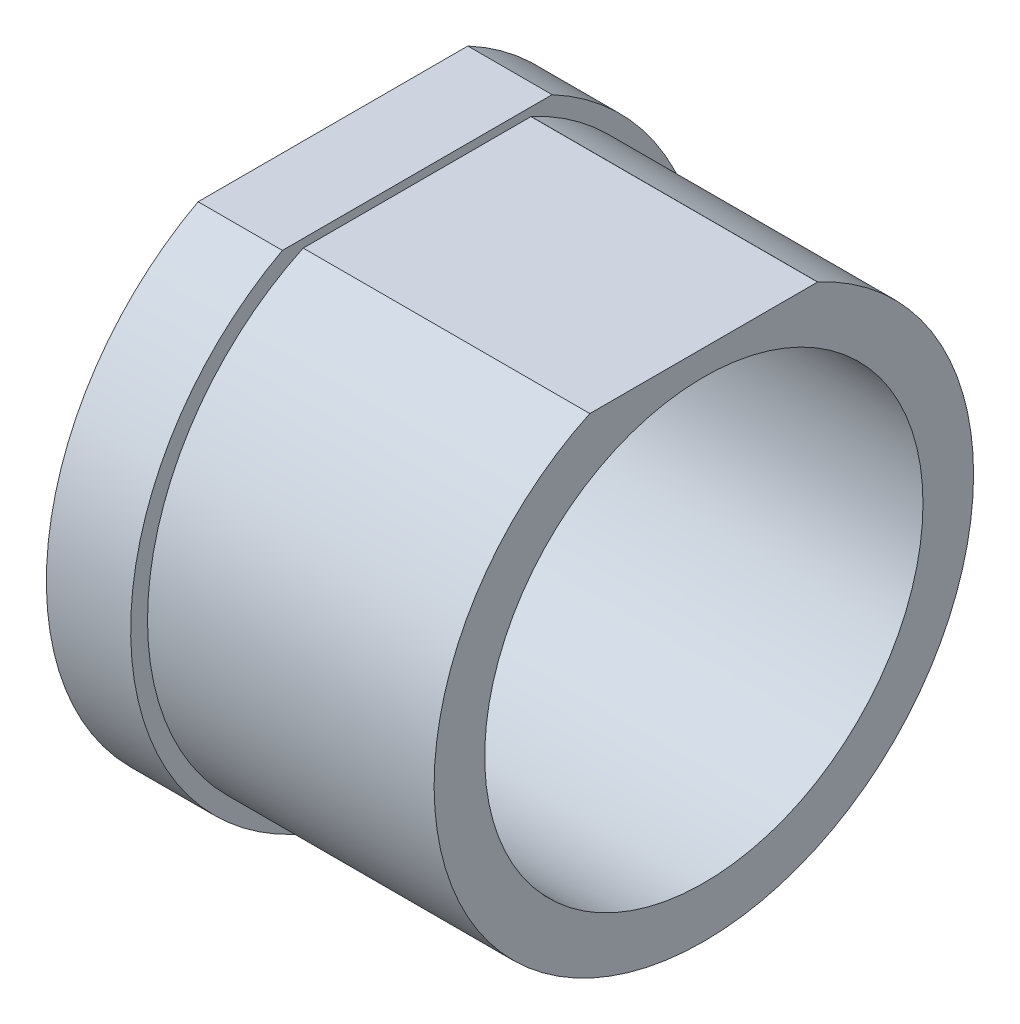
ISO-10303-21;
HEADER;
FILE_DESCRIPTION(('STEP AP214'),'2;1');
FILE_NAME('part.step','',(''),(''),'','','');
FILE_SCHEMA(('AUTOMOTIVE_DESIGN { 1 0 10303 214 1 1 1 1 }'));
ENDSEC;
DATA;
#1=APPLICATION_CONTEXT('core data for automotive mechanical design processes');
#2=APPLICATION_PROTOCOL_DEFINITION('international standard','automotive_design',2000,#1);
#3=PRODUCT_CONTEXT('',#1,'mechanical');
#4=PRODUCT('Part','Part','',(#3));
#5=PRODUCT_RELATED_PRODUCT_CATEGORY('part','',(#4));
#6=PRODUCT_DEFINITION_FORMATION('','',#4);
#7=PRODUCT_DEFINITION_CONTEXT('part definition',#1,'design');
#8=PRODUCT_DEFINITION('design','',#6,#7);
#9=PRODUCT_DEFINITION_SHAPE('','',#8);
#10=(LENGTH_UNIT() NAMED_UNIT(*) SI_UNIT(.MILLI.,.METRE.));
#11=(NAMED_UNIT(*) PLANE_ANGLE_UNIT() SI_UNIT($,.RADIAN.));
#12=(NAMED_UNIT(*) SI_UNIT($,.STERADIAN.) SOLID_ANGLE_UNIT());
#13=UNCERTAINTY_MEASURE_WITH_UNIT(LENGTH_MEASURE(1.E-05),#10,'distance_accuracy_value','');
#14=(GEOMETRIC_REPRESENTATION_CONTEXT(3) GLOBAL_UNCERTAINTY_ASSIGNED_CONTEXT((#13)) GLOBAL_UNIT_ASSIGNED_CONTEXT((#10,
#11,#12)) REPRESENTATION_CONTEXT('',''));
#15=CARTESIAN_POINT('',(0.,0.,0.));
#16=DIRECTION('',(0.,0.,1.));
#17=DIRECTION('',(1.,0.,0.));
#18=AXIS2_PLACEMENT_3D('',#15,#16,#17);
#19=CARTESIAN_POINT('',(10.,0.,0.));
#20=DIRECTION('',(-1.,0.,0.));
#21=DIRECTION('',(0.,0.,1.));
#22=AXIS2_PLACEMENT_3D('',#19,#20,#21);
#23=CYLINDRICAL_SURFACE('',#22,34.);
#24=CARTESIAN_POINT('',(10.,0.,0.));
#25=DIRECTION('',(1.,0.,0.));
#26=DIRECTION('',(0.,0.,-1.));
#27=AXIS2_PLACEMENT_3D('',#24,#25,#26);
#28=CIRCLE('',#27,34.);
#29=CARTESIAN_POINT('',(10.,30.,16.));
#30=VERTEX_POINT('',#29);
#31=CARTESIAN_POINT('',(10.,30.,-16.));
#32=VERTEX_POINT('',#31);
#33=EDGE_CURVE('E101',#30,#32,#28,.T.);
#34=ORIENTED_EDGE('',*,*,#33,.F.);
#35=DIRECTION('',(-1.,0.,0.));
#36=VECTOR('',#35,1.);
#37=CARTESIAN_POINT('',(10.,30.,16.));
#38=LINE('',#37,#36);
#39=CARTESIAN_POINT('',(0.,30.,16.));
#40=VERTEX_POINT('',#39);
#41=EDGE_CURVE('E89',#40,#30,#38,.F.);
#42=ORIENTED_EDGE('',*,*,#41,.F.);
#43=CARTESIAN_POINT('',(0.,0.,0.));
#44=DIRECTION('',(1.,0.,0.));
#45=DIRECTION('',(0.,0.,-1.));
#46=AXIS2_PLACEMENT_3D('',#43,#44,#45);
#47=CIRCLE('',#46,34.);
#48=CARTESIAN_POINT('',(0.,30.,-16.));
#49=VERTEX_POINT('',#48);
#50=EDGE_CURVE('E99',#40,#49,#47,.T.);
#51=ORIENTED_EDGE('',*,*,#50,.T.);
#52=DIRECTION('',(-1.,0.,0.));
#53=VECTOR('',#52,1.);
#54=CARTESIAN_POINT('',(10.,30.,-16.));
#55=LINE('',#54,#53);
#56=EDGE_CURVE('E58',#32,#49,#55,.T.);
#57=ORIENTED_EDGE('',*,*,#56,.F.);
#58=EDGE_LOOP('',(#34,#42,#51,#57));
#59=FACE_BOUND('',#58,.T.);
#60=ADVANCED_FACE('F43',(#59),#23,.T.);
#61=CARTESIAN_POINT('',(10.,0.,0.));
#62=DIRECTION('',(1.,0.,0.));
#63=DIRECTION('',(0.,0.,-1.));
#64=AXIS2_PLACEMENT_3D('',#61,#62,#63);
#65=PLANE('',#64);
#66=DIRECTION('',(0.,0.,1.));
#67=VECTOR('',#66,1.);
#68=CARTESIAN_POINT('',(10.,30.,-23.6606310705221));
#69=LINE('',#68,#67);
#70=EDGE_CURVE('E95',#32,#30,#69,.T.);
#71=ORIENTED_EDGE('',*,*,#70,.T.);
#72=ORIENTED_EDGE('',*,*,#33,.T.);
#73=EDGE_LOOP('',(#71,#72));
#74=FACE_BOUND('',#73,.T.);
#75=DIRECTION('',(0.,1.,0.));
#76=VECTOR('',#75,1.);
#77=CARTESIAN_POINT('',(10.,36.688048190982,-13.4918079689534));
#78=LINE('',#77,#76);
#79=CARTESIAN_POINT('',(10.,29.,-13.4918079689534));
#80=VERTEX_POINT('',#79);
#81=CARTESIAN_POINT('',(10.,29.0167385784289,-13.4918079689534));
#82=VERTEX_POINT('',#81);
#83=EDGE_CURVE('E135',#80,#82,#78,.T.);
#84=ORIENTED_EDGE('',*,*,#83,.T.);
#85=CARTESIAN_POINT('',(10.,0.,0.));
#86=DIRECTION('',(1.,0.,0.));
#87=DIRECTION('',(0.,0.,-1.));
#88=AXIS2_PLACEMENT_3D('',#85,#86,#87);
#89=CIRCLE('',#88,32.);
#90=CARTESIAN_POINT('',(10.,29.,13.5277492584687));
#91=VERTEX_POINT('',#90);
#92=EDGE_CURVE('E51',#91,#82,#89,.T.);
#93=ORIENTED_EDGE('',*,*,#92,.F.);
#94=DIRECTION('',(0.,0.,-1.));
#95=VECTOR('',#94,1.);
#96=CARTESIAN_POINT('',(10.,29.,13.5618643674799));
#97=LINE('',#96,#95);
#98=EDGE_CURVE('E139',#91,#80,#97,.T.);
#99=ORIENTED_EDGE('',*,*,#98,.T.);
#100=EDGE_LOOP('',(#84,#93,#99));
#101=FACE_BOUND('',#100,.T.);
#102=ADVANCED_FACE('F162',(#74,#101),#65,.T.);
#103=CARTESIAN_POINT('',(0.,0.,0.));
#104=DIRECTION('',(1.,0.,0.));
#105=DIRECTION('',(0.,0.,-1.));
#106=AXIS2_PLACEMENT_3D('',#103,#104,#105);
#107=PLANE('',#106);
#108=CARTESIAN_POINT('',(0.,0.,0.));
#109=DIRECTION('',(1.,0.,0.));
#110=DIRECTION('',(0.,0.,-1.));
#111=AXIS2_PLACEMENT_3D('',#108,#109,#110);
#112=CIRCLE('',#111,26.);
#113=CARTESIAN_POINT('',(0.,0.,-26.));
#114=VERTEX_POINT('',#113);
#115=EDGE_CURVE('E112',#114,#114,#112,.T.);
#116=ORIENTED_EDGE('',*,*,#115,.T.);
#117=EDGE_LOOP('',(#116));
#118=FACE_BOUND('',#117,.T.);
#119=ORIENTED_EDGE('',*,*,#50,.F.);
#120=DIRECTION('',(0.,0.,1.));
#121=VECTOR('',#120,1.);
#122=CARTESIAN_POINT('',(0.,30.,-23.6606310705221));
#123=LINE('',#122,#121);
#124=EDGE_CURVE('E86',#49,#40,#123,.T.);
#125=ORIENTED_EDGE('',*,*,#124,.F.);
#126=EDGE_LOOP('',(#119,#125));
#127=FACE_BOUND('',#126,.T.);
#128=ADVANCED_FACE('F104',(#118,#127),#107,.F.);
#129=CARTESIAN_POINT('',(44.,0.,0.));
#130=DIRECTION('',(-1.,0.,0.));
#131=DIRECTION('',(0.,0.,1.));
#132=AXIS2_PLACEMENT_3D('',#129,#130,#131);
#133=CYLINDRICAL_SURFACE('',#132,32.);
#134=ORIENTED_EDGE('',*,*,#92,.T.);
#135=DIRECTION('',(-1.,0.,0.));
#136=VECTOR('',#135,1.);
#137=CARTESIAN_POINT('',(44.,29.0167385784289,-13.4918079689534));
#138=LINE('',#137,#136);
#139=CARTESIAN_POINT('',(44.,29.0167385784289,-13.4918079689534));
#140=VERTEX_POINT('',#139);
#141=EDGE_CURVE('E122',#82,#140,#138,.F.);
#142=ORIENTED_EDGE('',*,*,#141,.T.);
#143=CARTESIAN_POINT('',(44.,0.,0.));
#144=DIRECTION('',(1.,0.,0.));
#145=DIRECTION('',(0.,0.,-1.));
#146=AXIS2_PLACEMENT_3D('',#143,#144,#145);
#147=CIRCLE('',#146,32.);
#148=CARTESIAN_POINT('',(44.,29.,13.5277492584687));
#149=VERTEX_POINT('',#148);
#150=EDGE_CURVE('E106',#149,#140,#147,.T.);
#151=ORIENTED_EDGE('',*,*,#150,.F.);
#152=DIRECTION('',(-1.,0.,0.));
#153=VECTOR('',#152,1.);
#154=CARTESIAN_POINT('',(44.,29.,13.5277492584687));
#155=LINE('',#154,#153);
#156=EDGE_CURVE('E65',#149,#91,#155,.T.);
#157=ORIENTED_EDGE('',*,*,#156,.T.);
#158=EDGE_LOOP('',(#134,#142,#151,#157));
#159=FACE_BOUND('',#158,.T.);
#160=ADVANCED_FACE('F171',(#159),#133,.T.);
#161=CARTESIAN_POINT('',(44.,0.,0.));
#162=DIRECTION('',(1.,0.,0.));
#163=DIRECTION('',(0.,0.,-1.));
#164=AXIS2_PLACEMENT_3D('',#161,#162,#163);
#165=PLANE('',#164);
#166=DIRECTION('',(0.,1.,0.));
#167=VECTOR('',#166,1.);
#168=CARTESIAN_POINT('',(44.,36.688048190982,-13.4918079689534));
#169=LINE('',#168,#167);
#170=CARTESIAN_POINT('',(44.,29.,-13.4918079689534));
#171=VERTEX_POINT('',#170);
#172=EDGE_CURVE('E136',#171,#140,#169,.T.);
#173=ORIENTED_EDGE('',*,*,#172,.F.);
#174=DIRECTION('',(0.,0.,-1.));
#175=VECTOR('',#174,1.);
#176=CARTESIAN_POINT('',(44.,29.,0.));
#177=LINE('',#176,#175);
#178=EDGE_CURVE('E11',#149,#171,#177,.T.);
#179=ORIENTED_EDGE('',*,*,#178,.F.);
#180=ORIENTED_EDGE('',*,*,#150,.T.);
#181=EDGE_LOOP('',(#173,#179,#180));
#182=FACE_BOUND('',#181,.T.);
#183=CARTESIAN_POINT('',(44.,0.,0.));
#184=DIRECTION('',(1.,0.,0.));
#185=DIRECTION('',(0.,0.,-1.));
#186=AXIS2_PLACEMENT_3D('',#183,#184,#185);
#187=CIRCLE('',#186,26.);
#188=CARTESIAN_POINT('',(44.,0.,-26.));
#189=VERTEX_POINT('',#188);
#190=EDGE_CURVE('E118',#189,#189,#187,.T.);
#191=ORIENTED_EDGE('',*,*,#190,.F.);
#192=EDGE_LOOP('',(#191));
#193=FACE_BOUND('',#192,.T.);
#194=ADVANCED_FACE('F175',(#182,#193),#165,.T.);
#195=CARTESIAN_POINT('',(0.,0.,0.));
#196=DIRECTION('',(1.,0.,0.));
#197=DIRECTION('',(0.,0.,-1.));
#198=AXIS2_PLACEMENT_3D('',#195,#196,#197);
#199=CYLINDRICAL_SURFACE('',#198,26.);
#200=ORIENTED_EDGE('',*,*,#115,.F.);
#201=EDGE_LOOP('',(#200));
#202=FACE_BOUND('',#201,.T.);
#203=ORIENTED_EDGE('',*,*,#190,.T.);
#204=EDGE_LOOP('',(#203));
#205=FACE_BOUND('',#204,.T.);
#206=ADVANCED_FACE('F180',(#202,#205),#199,.F.);
#207=CARTESIAN_POINT('',(10.,36.688048190982,-13.4918079689534));
#208=DIRECTION('',(0.,0.,-1.));
#209=DIRECTION('',(0.,1.,0.));
#210=AXIS2_PLACEMENT_3D('',#207,#208,#209);
#211=PLANE('',#210);
#212=ORIENTED_EDGE('',*,*,#83,.F.);
#213=DIRECTION('',(1.,0.,0.));
#214=VECTOR('',#213,1.);
#215=CARTESIAN_POINT('',(10.,29.,-13.4918079689534));
#216=LINE('',#215,#214);
#217=EDGE_CURVE('E131',#80,#171,#216,.T.);
#218=ORIENTED_EDGE('',*,*,#217,.T.);
#219=ORIENTED_EDGE('',*,*,#172,.T.);
#220=ORIENTED_EDGE('',*,*,#141,.F.);
#221=EDGE_LOOP('',(#212,#218,#219,#220));
#222=FACE_BOUND('',#221,.T.);
#223=ADVANCED_FACE('F178',(#222),#211,.F.);
#224=CARTESIAN_POINT('',(10.,29.,13.5618643674799));
#225=DIRECTION('',(0.,-1.,0.));
#226=DIRECTION('',(0.,0.,-1.));
#227=AXIS2_PLACEMENT_3D('',#224,#225,#226);
#228=PLANE('',#227);
#229=ORIENTED_EDGE('',*,*,#178,.T.);
#230=ORIENTED_EDGE('',*,*,#217,.F.);
#231=ORIENTED_EDGE('',*,*,#98,.F.);
#232=ORIENTED_EDGE('',*,*,#156,.F.);
#233=EDGE_LOOP('',(#229,#230,#231,#232));
#234=FACE_BOUND('',#233,.T.);
#235=ADVANCED_FACE('F177',(#234),#228,.F.);
#236=CARTESIAN_POINT('',(44.001,30.,-23.6606310705221));
#237=DIRECTION('',(0.,-1.,0.));
#238=DIRECTION('',(0.,0.,-1.));
#239=AXIS2_PLACEMENT_3D('',#236,#237,#238);
#240=PLANE('',#239);
#241=ORIENTED_EDGE('',*,*,#41,.T.);
#242=ORIENTED_EDGE('',*,*,#70,.F.);
#243=ORIENTED_EDGE('',*,*,#56,.T.);
#244=ORIENTED_EDGE('',*,*,#124,.T.);
#245=EDGE_LOOP('',(#241,#242,#243,#244));
#246=FACE_BOUND('',#245,.T.);
#247=ADVANCED_FACE('F88',(#246),#240,.F.);
#248=CLOSED_SHELL('',(#60,#102,#128,#160,#194,#206,#223,#235,#247));
#249=MANIFOLD_SOLID_BREP('B2',#248);
#250=ADVANCED_BREP_SHAPE_REPRESENTATION('',(#18,#249),#14);
#251=SHAPE_DEFINITION_REPRESENTATION(#9,#250);
ENDSEC;
END-ISO-10303-21;
